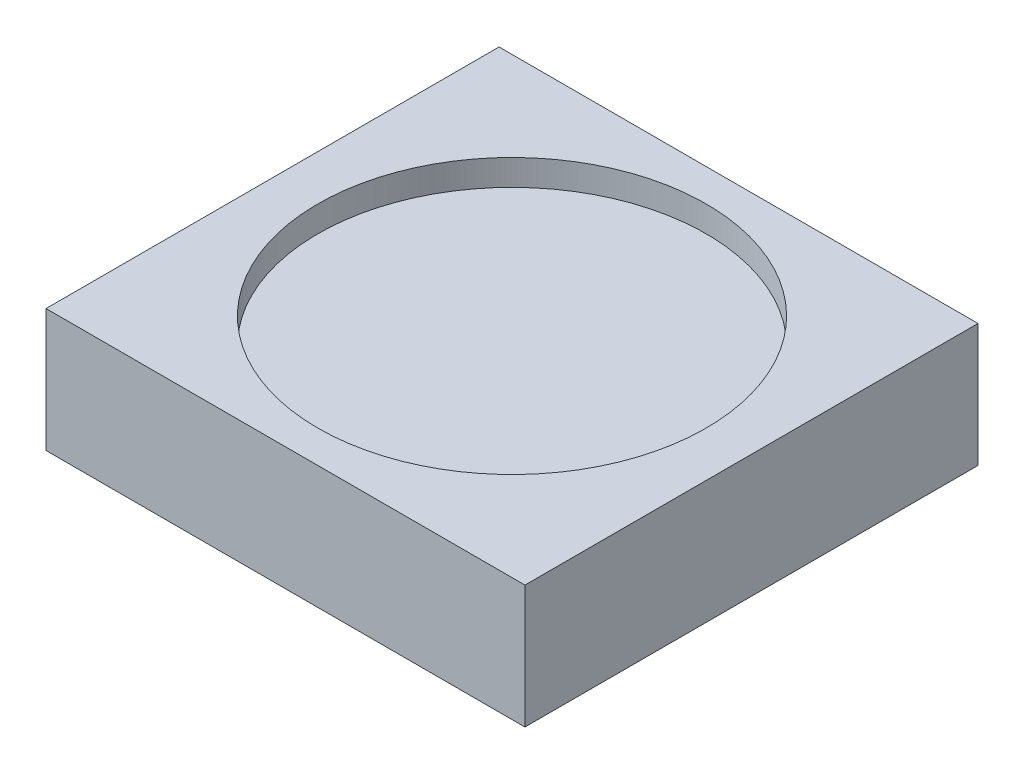
ISO-10303-21;
HEADER;
FILE_DESCRIPTION(('STEP AP214'),'2;1');
FILE_NAME('part.step','',(''),(''),'','','');
FILE_SCHEMA(('AUTOMOTIVE_DESIGN { 1 0 10303 214 1 1 1 1 }'));
ENDSEC;
DATA;
#1=APPLICATION_CONTEXT('core data for automotive mechanical design processes');
#2=APPLICATION_PROTOCOL_DEFINITION('international standard','automotive_design',2000,#1);
#3=PRODUCT_CONTEXT('',#1,'mechanical');
#4=PRODUCT('Part','Part','',(#3));
#5=PRODUCT_RELATED_PRODUCT_CATEGORY('part','',(#4));
#6=PRODUCT_DEFINITION_FORMATION('','',#4);
#7=PRODUCT_DEFINITION_CONTEXT('part definition',#1,'design');
#8=PRODUCT_DEFINITION('design','',#6,#7);
#9=PRODUCT_DEFINITION_SHAPE('','',#8);
#10=(LENGTH_UNIT() NAMED_UNIT(*) SI_UNIT(.MILLI.,.METRE.));
#11=(NAMED_UNIT(*) PLANE_ANGLE_UNIT() SI_UNIT($,.RADIAN.));
#12=(NAMED_UNIT(*) SI_UNIT($,.STERADIAN.) SOLID_ANGLE_UNIT());
#13=UNCERTAINTY_MEASURE_WITH_UNIT(LENGTH_MEASURE(1.E-05),#10,'distance_accuracy_value','');
#14=(GEOMETRIC_REPRESENTATION_CONTEXT(3) GLOBAL_UNCERTAINTY_ASSIGNED_CONTEXT((#13)) GLOBAL_UNIT_ASSIGNED_CONTEXT((#10,
#11,#12)) REPRESENTATION_CONTEXT('',''));
#15=CARTESIAN_POINT('',(0.,0.,0.));
#16=DIRECTION('',(0.,0.,1.));
#17=DIRECTION('',(1.,0.,0.));
#18=AXIS2_PLACEMENT_3D('',#15,#16,#17);
#19=CARTESIAN_POINT('',(0.,0.95,0.));
#20=DIRECTION('',(1.,0.,0.));
#21=DIRECTION('',(0.,0.,-1.));
#22=AXIS2_PLACEMENT_3D('',#19,#20,#21);
#23=PLANE('',#22);
#24=DIRECTION('',(0.,0.,1.));
#25=VECTOR('',#24,1.);
#26=CARTESIAN_POINT('',(0.,0.,0.));
#27=LINE('',#26,#25);
#28=CARTESIAN_POINT('',(0.,0.,-3.5));
#29=VERTEX_POINT('',#28);
#30=CARTESIAN_POINT('',(0.,0.,0.));
#31=VERTEX_POINT('',#30);
#32=EDGE_CURVE('E96',#29,#31,#27,.T.);
#33=ORIENTED_EDGE('',*,*,#32,.T.);
#34=DIRECTION('',(0.,-1.,0.));
#35=VECTOR('',#34,1.);
#36=CARTESIAN_POINT('',(0.,0.95,0.));
#37=LINE('',#36,#35);
#38=CARTESIAN_POINT('',(0.,0.95,0.));
#39=VERTEX_POINT('',#38);
#40=EDGE_CURVE('E11',#39,#31,#37,.T.);
#41=ORIENTED_EDGE('',*,*,#40,.F.);
#42=DIRECTION('',(0.,0.,1.));
#43=VECTOR('',#42,1.);
#44=CARTESIAN_POINT('',(0.,0.95,0.));
#45=LINE('',#44,#43);
#46=CARTESIAN_POINT('',(0.,0.95,-3.5));
#47=VERTEX_POINT('',#46);
#48=EDGE_CURVE('E84',#47,#39,#45,.T.);
#49=ORIENTED_EDGE('',*,*,#48,.F.);
#50=DIRECTION('',(0.,-1.,0.));
#51=VECTOR('',#50,1.);
#52=CARTESIAN_POINT('',(0.,0.95,-3.5));
#53=LINE('',#52,#51);
#54=EDGE_CURVE('E92',#47,#29,#53,.T.);
#55=ORIENTED_EDGE('',*,*,#54,.T.);
#56=EDGE_LOOP('',(#33,#41,#49,#55));
#57=FACE_BOUND('',#56,.T.);
#58=ADVANCED_FACE('F33',(#57),#23,.F.);
#59=CARTESIAN_POINT('',(0.,0.95,0.));
#60=DIRECTION('',(0.,0.,-1.));
#61=DIRECTION('',(-1.,0.,0.));
#62=AXIS2_PLACEMENT_3D('',#59,#60,#61);
#63=PLANE('',#62);
#64=DIRECTION('',(1.,0.,0.));
#65=VECTOR('',#64,1.);
#66=CARTESIAN_POINT('',(0.,0.,0.));
#67=LINE('',#66,#65);
#68=CARTESIAN_POINT('',(3.7,0.,0.));
#69=VERTEX_POINT('',#68);
#70=EDGE_CURVE('E88',#31,#69,#67,.T.);
#71=ORIENTED_EDGE('',*,*,#70,.T.);
#72=DIRECTION('',(0.,-1.,0.));
#73=VECTOR('',#72,1.);
#74=CARTESIAN_POINT('',(3.7,0.95,0.));
#75=LINE('',#74,#73);
#76=CARTESIAN_POINT('',(3.7,0.95,0.));
#77=VERTEX_POINT('',#76);
#78=EDGE_CURVE('E41',#77,#69,#75,.T.);
#79=ORIENTED_EDGE('',*,*,#78,.F.);
#80=DIRECTION('',(1.,0.,0.));
#81=VECTOR('',#80,1.);
#82=CARTESIAN_POINT('',(0.,0.95,0.));
#83=LINE('',#82,#81);
#84=EDGE_CURVE('E79',#39,#77,#83,.T.);
#85=ORIENTED_EDGE('',*,*,#84,.F.);
#86=ORIENTED_EDGE('',*,*,#40,.T.);
#87=EDGE_LOOP('',(#71,#79,#85,#86));
#88=FACE_BOUND('',#87,.T.);
#89=ADVANCED_FACE('F87',(#88),#63,.F.);
#90=CARTESIAN_POINT('',(3.7,0.95,0.));
#91=DIRECTION('',(-1.,0.,0.));
#92=DIRECTION('',(0.,0.,1.));
#93=AXIS2_PLACEMENT_3D('',#90,#91,#92);
#94=PLANE('',#93);
#95=DIRECTION('',(0.,0.,-1.));
#96=VECTOR('',#95,1.);
#97=CARTESIAN_POINT('',(3.7,0.,0.));
#98=LINE('',#97,#96);
#99=CARTESIAN_POINT('',(3.7,0.,-3.5));
#100=VERTEX_POINT('',#99);
#101=EDGE_CURVE('E66',#69,#100,#98,.T.);
#102=ORIENTED_EDGE('',*,*,#101,.T.);
#103=DIRECTION('',(0.,-1.,0.));
#104=VECTOR('',#103,1.);
#105=CARTESIAN_POINT('',(3.7,0.95,-3.5));
#106=LINE('',#105,#104);
#107=CARTESIAN_POINT('',(3.7,0.95,-3.5));
#108=VERTEX_POINT('',#107);
#109=EDGE_CURVE('E89',#108,#100,#106,.T.);
#110=ORIENTED_EDGE('',*,*,#109,.F.);
#111=DIRECTION('',(0.,0.,-1.));
#112=VECTOR('',#111,1.);
#113=CARTESIAN_POINT('',(3.7,0.95,0.));
#114=LINE('',#113,#112);
#115=EDGE_CURVE('E82',#77,#108,#114,.T.);
#116=ORIENTED_EDGE('',*,*,#115,.F.);
#117=ORIENTED_EDGE('',*,*,#78,.T.);
#118=EDGE_LOOP('',(#102,#110,#116,#117));
#119=FACE_BOUND('',#118,.T.);
#120=ADVANCED_FACE('F90',(#119),#94,.F.);
#121=CARTESIAN_POINT('',(0.,0.95,-3.5));
#122=DIRECTION('',(0.,0.,1.));
#123=DIRECTION('',(1.,0.,0.));
#124=AXIS2_PLACEMENT_3D('',#121,#122,#123);
#125=PLANE('',#124);
#126=DIRECTION('',(-1.,0.,0.));
#127=VECTOR('',#126,1.);
#128=CARTESIAN_POINT('',(0.,0.,-3.5));
#129=LINE('',#128,#127);
#130=EDGE_CURVE('E72',#100,#29,#129,.T.);
#131=ORIENTED_EDGE('',*,*,#130,.T.);
#132=ORIENTED_EDGE('',*,*,#54,.F.);
#133=DIRECTION('',(-1.,0.,0.));
#134=VECTOR('',#133,1.);
#135=CARTESIAN_POINT('',(0.,0.95,-3.5));
#136=LINE('',#135,#134);
#137=EDGE_CURVE('E49',#108,#47,#136,.T.);
#138=ORIENTED_EDGE('',*,*,#137,.F.);
#139=ORIENTED_EDGE('',*,*,#109,.T.);
#140=EDGE_LOOP('',(#131,#132,#138,#139));
#141=FACE_BOUND('',#140,.T.);
#142=ADVANCED_FACE('F104',(#141),#125,.F.);
#143=CARTESIAN_POINT('',(0.,0.95,0.));
#144=DIRECTION('',(0.,-1.,0.));
#145=DIRECTION('',(0.,0.,-1.));
#146=AXIS2_PLACEMENT_3D('',#143,#144,#145);
#147=PLANE('',#146);
#148=CARTESIAN_POINT('',(1.85,0.95,-1.75));
#149=DIRECTION('',(0.,1.,0.));
#150=DIRECTION('',(0.,0.,1.));
#151=AXIS2_PLACEMENT_3D('',#148,#149,#150);
#152=CIRCLE('',#151,1.5);
#153=CARTESIAN_POINT('',(1.85,0.95,-0.25));
#154=VERTEX_POINT('',#153);
#155=EDGE_CURVE('E110',#154,#154,#152,.T.);
#156=ORIENTED_EDGE('',*,*,#155,.F.);
#157=EDGE_LOOP('',(#156));
#158=FACE_BOUND('',#157,.T.);
#159=ORIENTED_EDGE('',*,*,#48,.T.);
#160=ORIENTED_EDGE('',*,*,#84,.T.);
#161=ORIENTED_EDGE('',*,*,#115,.T.);
#162=ORIENTED_EDGE('',*,*,#137,.T.);
#163=EDGE_LOOP('',(#159,#160,#161,#162));
#164=FACE_BOUND('',#163,.T.);
#165=ADVANCED_FACE('F80',(#158,#164),#147,.F.);
#166=CARTESIAN_POINT('',(0.,0.,0.));
#167=DIRECTION('',(0.,-1.,0.));
#168=DIRECTION('',(0.,0.,-1.));
#169=AXIS2_PLACEMENT_3D('',#166,#167,#168);
#170=PLANE('',#169);
#171=ORIENTED_EDGE('',*,*,#32,.F.);
#172=ORIENTED_EDGE('',*,*,#130,.F.);
#173=ORIENTED_EDGE('',*,*,#101,.F.);
#174=ORIENTED_EDGE('',*,*,#70,.F.);
#175=EDGE_LOOP('',(#171,#172,#173,#174));
#176=FACE_BOUND('',#175,.T.);
#177=ADVANCED_FACE('F107',(#176),#170,.T.);
#178=CARTESIAN_POINT('',(1.85,0.75,-1.75));
#179=DIRECTION('',(0.,1.,0.));
#180=DIRECTION('',(0.,0.,1.));
#181=AXIS2_PLACEMENT_3D('',#178,#179,#180);
#182=CYLINDRICAL_SURFACE('',#181,1.5);
#183=CARTESIAN_POINT('',(1.85,0.75,-1.75));
#184=DIRECTION('',(0.,1.,0.));
#185=DIRECTION('',(0.,0.,1.));
#186=AXIS2_PLACEMENT_3D('',#183,#184,#185);
#187=CIRCLE('',#186,1.5);
#188=CARTESIAN_POINT('',(1.85,0.75,-0.25));
#189=VERTEX_POINT('',#188);
#190=EDGE_CURVE('E99',#189,#189,#187,.T.);
#191=ORIENTED_EDGE('',*,*,#190,.F.);
#192=EDGE_LOOP('',(#191));
#193=FACE_BOUND('',#192,.T.);
#194=ORIENTED_EDGE('',*,*,#155,.T.);
#195=EDGE_LOOP('',(#194));
#196=FACE_BOUND('',#195,.T.);
#197=ADVANCED_FACE('F118',(#193,#196),#182,.F.);
#198=CARTESIAN_POINT('',(1.85,0.75,-1.75));
#199=DIRECTION('',(0.,1.,0.));
#200=DIRECTION('',(0.,0.,1.));
#201=AXIS2_PLACEMENT_3D('',#198,#199,#200);
#202=PLANE('',#201);
#203=ORIENTED_EDGE('',*,*,#190,.T.);
#204=EDGE_LOOP('',(#203));
#205=FACE_BOUND('',#204,.T.);
#206=ADVANCED_FACE('F116',(#205),#202,.T.);
#207=CLOSED_SHELL('',(#58,#89,#120,#142,#165,#177,#197,#206));
#208=MANIFOLD_SOLID_BREP('B2',#207);
#209=ADVANCED_BREP_SHAPE_REPRESENTATION('',(#18,#208),#14);
#210=SHAPE_DEFINITION_REPRESENTATION(#9,#209);
ENDSEC;
END-ISO-10303-21;
